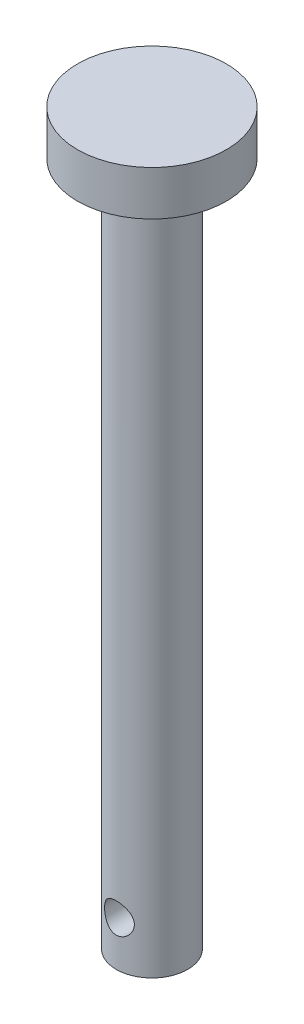
ISO-10303-21;
HEADER;
FILE_DESCRIPTION(('STEP AP214'),'2;1');
FILE_NAME('part.step','',(''),(''),'','','');
FILE_SCHEMA(('AUTOMOTIVE_DESIGN { 1 0 10303 214 1 1 1 1 }'));
ENDSEC;
DATA;
#1=APPLICATION_CONTEXT('core data for automotive mechanical design processes');
#2=APPLICATION_PROTOCOL_DEFINITION('international standard','automotive_design',2000,#1);
#3=PRODUCT_CONTEXT('',#1,'mechanical');
#4=PRODUCT('Part','Part','',(#3));
#5=PRODUCT_RELATED_PRODUCT_CATEGORY('part','',(#4));
#6=PRODUCT_DEFINITION_FORMATION('','',#4);
#7=PRODUCT_DEFINITION_CONTEXT('part definition',#1,'design');
#8=PRODUCT_DEFINITION('design','',#6,#7);
#9=PRODUCT_DEFINITION_SHAPE('','',#8);
#10=(LENGTH_UNIT() NAMED_UNIT(*) SI_UNIT(.MILLI.,.METRE.));
#11=(NAMED_UNIT(*) PLANE_ANGLE_UNIT() SI_UNIT($,.RADIAN.));
#12=(NAMED_UNIT(*) SI_UNIT($,.STERADIAN.) SOLID_ANGLE_UNIT());
#13=UNCERTAINTY_MEASURE_WITH_UNIT(LENGTH_MEASURE(1.E-05),#10,'distance_accuracy_value','');
#14=(GEOMETRIC_REPRESENTATION_CONTEXT(3) GLOBAL_UNCERTAINTY_ASSIGNED_CONTEXT((#13)) GLOBAL_UNIT_ASSIGNED_CONTEXT((#10,
#11,#12)) REPRESENTATION_CONTEXT('',''));
#15=CARTESIAN_POINT('',(0.,0.,0.));
#16=DIRECTION('',(0.,0.,1.));
#17=DIRECTION('',(1.,0.,0.));
#18=AXIS2_PLACEMENT_3D('',#15,#16,#17);
#19=CARTESIAN_POINT('',(0.,46.,0.));
#20=DIRECTION('',(0.,-1.,0.));
#21=DIRECTION('',(0.,0.,-1.));
#22=AXIS2_PLACEMENT_3D('',#19,#20,#21);
#23=CYLINDRICAL_SURFACE('',#22,2.4);
#24=CARTESIAN_POINT('',(0.,4.,-2.4));
#25=CARTESIAN_POINT('',(-0.0535664421090133,3.99999423592697,-2.39999566693818));
#26=CARTESIAN_POINT('',(-0.107217117651072,3.99567043317749,-2.39818586379768));
#27=CARTESIAN_POINT('',(-0.212997896925077,3.97852874806386,-2.39112122863641));
#28=CARTESIAN_POINT('',(-0.265123661138851,3.9656887004286,-2.38585740720822));
#29=CARTESIAN_POINT('',(-0.366150986922471,3.93207112657553,-2.37245031230502));
#30=CARTESIAN_POINT('',(-0.415062819541015,3.91132048842548,-2.36431679980003));
#31=CARTESIAN_POINT('',(-0.508663805343842,3.86258174141395,-2.34596229176531));
#32=CARTESIAN_POINT('',(-0.553354232012752,3.83459582482331,-2.33574192874279));
#33=CARTESIAN_POINT('',(-0.63955872284761,3.7706968139273,-2.31366262681495));
#34=CARTESIAN_POINT('',(-0.680833014014215,3.7344789529682,-2.30175002660874));
#35=CARTESIAN_POINT('',(-0.75692785687301,3.65578853217395,-2.27786171254811));
#36=CARTESIAN_POINT('',(-0.791745010522468,3.6133127000844,-2.26588596885447));
#37=CARTESIAN_POINT('',(-0.855629901576524,3.52077857794809,-2.24256817450396));
#38=CARTESIAN_POINT('',(-0.8843304652314,3.47045004125877,-2.23128629498708));
#39=CARTESIAN_POINT('',(-0.932751524710926,3.36514139366326,-2.21148457885604));
#40=CARTESIAN_POINT('',(-0.952476646690327,3.31016369641244,-2.20296332000659));
#41=CARTESIAN_POINT('',(-0.981396786497271,3.19987704658566,-2.19022844310164));
#42=CARTESIAN_POINT('',(-0.991053263020845,3.14471161328628,-2.1858271012143));
#43=CARTESIAN_POINT('',(-1.00100167974237,3.03338136585074,-2.18129060975603));
#44=CARTESIAN_POINT('',(-1.00129878443518,2.97721711997941,-2.18115310740208));
#45=CARTESIAN_POINT('',(-0.992867602909391,2.87007995165205,-2.18500095648682));
#46=CARTESIAN_POINT('',(-0.984829448898407,2.81903912274843,-2.18867106178898));
#47=CARTESIAN_POINT('',(-0.961113528126214,2.71911032719969,-2.19918786219037));
#48=CARTESIAN_POINT('',(-0.945434298297415,2.67022277480658,-2.20603516562851));
#49=CARTESIAN_POINT('',(-0.906575669820569,2.57475383760685,-2.22228947818205));
#50=CARTESIAN_POINT('',(-0.883243772313889,2.5282436632693,-2.23174785559309));
#51=CARTESIAN_POINT('',(-0.8298499406445,2.43961781289588,-2.25214664912869));
#52=CARTESIAN_POINT('',(-0.799785352415636,2.39750387950919,-2.26308764903824));
#53=CARTESIAN_POINT('',(-0.730796772435069,2.31512003301373,-2.28634381502383));
#54=CARTESIAN_POINT('',(-0.691338786566022,2.27530674609165,-2.29869697123578));
#55=CARTESIAN_POINT('',(-0.606183672841211,2.20270919763265,-2.32260538490023));
#56=CARTESIAN_POINT('',(-0.560485087558766,2.16992658264626,-2.33416045501608));
#57=CARTESIAN_POINT('',(-0.462758358954702,2.11165134110699,-2.35550626845178));
#58=CARTESIAN_POINT('',(-0.410608465958145,2.08634444387945,-2.36525013234667));
#59=CARTESIAN_POINT('',(-0.302281922021466,2.04502308831739,-2.38151585131843));
#60=CARTESIAN_POINT('',(-0.246107515836029,2.02900349444495,-2.3880394867664));
#61=CARTESIAN_POINT('',(-0.135142490676983,2.00766720629869,-2.39679712949108));
#62=CARTESIAN_POINT('',(-0.0804890282229121,2.001737714045,-2.399276328377));
#63=CARTESIAN_POINT('',(0.0290837243968705,1.99892302110872,-2.40044840294996));
#64=CARTESIAN_POINT('',(0.0840029337221078,2.0020352237984,-2.39914236569551));
#65=CARTESIAN_POINT('',(0.189678593873148,2.01677686784485,-2.39304974125552));
#66=CARTESIAN_POINT('',(0.240506373311509,2.02797596327776,-2.38843909827192));
#67=CARTESIAN_POINT('',(0.339506199176872,2.05797455563263,-2.37638885417931));
#68=CARTESIAN_POINT('',(0.387677909214688,2.07677501276024,-2.36894889567763));
#69=CARTESIAN_POINT('',(0.481687199895309,2.12205678056969,-2.35166616516132));
#70=CARTESIAN_POINT('',(0.527405789484259,2.14875854651683,-2.34175593175425));
#71=CARTESIAN_POINT('',(0.613876972985143,2.20884270223336,-2.32059043663272));
#72=CARTESIAN_POINT('',(0.654627482081553,2.24222788122342,-2.30933461414986));
#73=CARTESIAN_POINT('',(0.733066744219411,2.31752258661793,-2.2856967031635));
#74=CARTESIAN_POINT('',(0.770328558383868,2.35987080238901,-2.27329161272823));
#75=CARTESIAN_POINT('',(0.837335876884407,2.45041702074831,-2.24947469414404));
#76=CARTESIAN_POINT('',(0.867079674284939,2.49861634813739,-2.23806309194751));
#77=CARTESIAN_POINT('',(0.918527681669594,2.60049134024206,-2.2174510899519));
#78=CARTESIAN_POINT('',(0.940111345898631,2.65423522841186,-2.20828450044089));
#79=CARTESIAN_POINT('',(0.973739311612583,2.76509647504808,-2.19366684527166));
#80=CARTESIAN_POINT('',(0.985791478909501,2.82221100998668,-2.18821271644602));
#81=CARTESIAN_POINT('',(0.999232642791205,2.93345495935937,-2.18210531629811));
#82=CARTESIAN_POINT('',(1.00137104330503,2.98747572983409,-2.1811148077373));
#83=CARTESIAN_POINT('',(0.996924604191299,3.09507428891288,-2.18315082408819));
#84=CARTESIAN_POINT('',(0.990341103717773,3.14865214425095,-2.18617673232245));
#85=CARTESIAN_POINT('',(0.969267238243931,3.25127419797511,-2.19559641041814));
#86=CARTESIAN_POINT('',(0.95515922857173,3.30041333877071,-2.20182683877184));
#87=CARTESIAN_POINT('',(0.919810625617077,3.39563841708578,-2.21682544959351));
#88=CARTESIAN_POINT('',(0.898568028138016,3.44172349231903,-2.22559434505355));
#89=CARTESIAN_POINT('',(0.848082287483917,3.5325567167593,-2.2453356364801));
#90=CARTESIAN_POINT('',(0.818434887283867,3.57705786413463,-2.25640882170943));
#91=CARTESIAN_POINT('',(0.752547258104314,3.66068811148854,-2.27922951243071));
#92=CARTESIAN_POINT('',(0.716304743124496,3.69981534048046,-2.290977250767));
#93=CARTESIAN_POINT('',(0.635121636623058,3.7745189453478,-2.31485114280085));
#94=CARTESIAN_POINT('',(0.589739791959223,3.80962914627252,-2.32694254009433));
#95=CARTESIAN_POINT('',(0.493280063402561,3.8717595628349,-2.34928114897616));
#96=CARTESIAN_POINT('',(0.442199598356598,3.89877609191164,-2.35952751933392));
#97=CARTESIAN_POINT('',(0.336585645374361,3.94336787635191,-2.37687346689968));
#98=CARTESIAN_POINT('',(0.28212319278451,3.96109181329384,-2.38402226065571));
#99=CARTESIAN_POINT('',(0.170728337477248,3.98696506326227,-2.394568078149));
#100=CARTESIAN_POINT('',(0.113804253584767,3.99514435402391,-2.39797684649573));
#101=CARTESIAN_POINT('',(0.037788865535347,3.99946652886916,-2.39977830055147));
#102=CARTESIAN_POINT('',(0.0188996757405259,4.00000203371938,-2.40000152882029));
#103=CARTESIAN_POINT('',(0.,4.,-2.4));
#104=B_SPLINE_CURVE_WITH_KNOTS('',3,(#24,#25,#26,#27,#28,#29,#30,#31,#32,#33,#34,#35,#36,#37,
#38,#39,#40,#41,#42,#43,#44,#45,#46,#47,#48,#49,#50,#51,#52,#53,#54,#55,#56,#57,#58,#59,#60,#61,
#62,#63,#64,#65,#66,#67,#68,#69,#70,#71,#72,#73,#74,#75,#76,#77,#78,#79,#80,#81,#82,#83,#84,#85,
#86,#87,#88,#89,#90,#91,#92,#93,#94,#95,#96,#97,#98,#99,#100,#101,#102,#103),.UNSPECIFIED.,.T.,
.F.,(4,2,2,2,2,2,2,2,2,2,2,2,2,2,2,2,2,2,2,2,2,2,2,2,2,2,2,2,2,2,2,2,2,2,2,2,2,2,2,4),(0.,
0.160645535107151,0.321710832502957,0.482233481525041,0.64270754948238,0.810543490310456,
0.978467505051724,1.154653796313,1.3307491738447,1.49836218510046,1.66588270599237,
1.82056125762045,1.9752694378177,2.13326970446972,2.29133236573765,2.46275312902317,
2.6342139945167,2.80963244048651,2.98495379374638,3.14918754714601,3.31337413994538,
3.46941271788577,3.62547101281428,3.78637708217729,3.94735044375597,4.11982790423436,
4.29234448992273,4.46731830687619,4.64214757659665,4.80351902047715,4.96486569038029,
5.1187011997181,5.2725799596049,5.43571114717953,5.59889898740755,5.77397228003912,
5.94912519542866,6.12138284655508,6.29309800375457,6.34977805199279),.UNSPECIFIED.);
#105=CARTESIAN_POINT('',(0.,4.,-2.4));
#106=VERTEX_POINT('',#105);
#107=EDGE_CURVE('E35',#106,#106,#104,.T.);
#108=ORIENTED_EDGE('',*,*,#107,.T.);
#109=EDGE_LOOP('',(#108));
#110=FACE_BOUND('',#109,.T.);
#111=CARTESIAN_POINT('',(1.,3.,2.18174242292714));
#112=CARTESIAN_POINT('',(0.99999407253254,2.94666248728252,2.18174815650575));
#113=CARTESIAN_POINT('',(0.995705631052022,2.89323787453903,2.1837268762752));
#114=CARTESIAN_POINT('',(0.978717431582277,2.78793044635429,2.19139066920707));
#115=CARTESIAN_POINT('',(0.965994832026212,2.73605221865981,2.19708580659413));
#116=CARTESIAN_POINT('',(0.932719907355606,2.63555109624714,2.21141534059814));
#117=CARTESIAN_POINT('',(0.912199499451424,2.58691586902799,2.22003774050092));
#118=CARTESIAN_POINT('',(0.864005102035701,2.49379244033756,2.23923318852634));
#119=CARTESIAN_POINT('',(0.83633280473225,2.4493032612535,2.24980577504627));
#120=CARTESIAN_POINT('',(0.772779106140933,2.36293942002122,2.27244610095885));
#121=CARTESIAN_POINT('',(0.736522590547527,2.32135395300473,2.28456454463317));
#122=CARTESIAN_POINT('',(0.65761734059644,2.24463982200195,2.30851436297781));
#123=CARTESIAN_POINT('',(0.614966153099204,2.20951364750959,2.32034562544631));
#124=CARTESIAN_POINT('',(0.522210715037879,2.14524037529658,2.34300430344491));
#125=CARTESIAN_POINT('',(0.471863434946927,2.11641869757412,2.35376591980233));
#126=CARTESIAN_POINT('',(0.366505617889882,2.06777918359552,2.37245215994741));
#127=CARTESIAN_POINT('',(0.311497163897699,2.04795735042863,2.38037804277725));
#128=CARTESIAN_POINT('',(0.201414798420132,2.01892843299461,2.39214016833893));
#129=CARTESIAN_POINT('',(0.146493260956864,2.00922264407836,2.39616776901973));
#130=CARTESIAN_POINT('',(0.0356633442920048,1.99908988707211,2.40037462888963));
#131=CARTESIAN_POINT('',(-0.0202446254116131,1.99865915529363,2.40055544904812));
#132=CARTESIAN_POINT('',(-0.127834224090054,2.00682742474666,2.39716103306445));
#133=CARTESIAN_POINT('',(-0.179565990885851,2.01487848042058,2.39381371718931));
#134=CARTESIAN_POINT('',(-0.280866315145165,2.03884248211053,2.38405213400247));
#135=CARTESIAN_POINT('',(-0.330434712843933,2.05475600770413,2.37763764059661));
#136=CARTESIAN_POINT('',(-0.42691049446202,2.09418243271571,2.36223881931223));
#137=CARTESIAN_POINT('',(-0.473765741659925,2.11780757029666,2.35321677700868));
#138=CARTESIAN_POINT('',(-0.562969413825571,2.17187660536027,2.33348571191844));
#139=CARTESIAN_POINT('',(-0.605316238205579,2.20232291267599,2.32277609333004));
#140=CARTESIAN_POINT('',(-0.687472729366339,2.27166593632369,2.29985359021649));
#141=CARTESIAN_POINT('',(-0.726893149852992,2.3110070330232,2.28758795484808));
#142=CARTESIAN_POINT('',(-0.798745131942134,2.39576915256526,2.26350288545176));
#143=CARTESIAN_POINT('',(-0.831173996659451,2.44119251063367,2.25168362505096));
#144=CARTESIAN_POINT('',(-0.889121514000508,2.53871602932953,2.22945289884271));
#145=CARTESIAN_POINT('',(-0.914378026844322,2.59098656459462,2.21910046845371));
#146=CARTESIAN_POINT('',(-0.955571456467133,2.6995848359796,2.20167875376809));
#147=CARTESIAN_POINT('',(-0.971515037018505,2.75590963861564,2.19460712267675));
#148=CARTESIAN_POINT('',(-0.99264020134497,2.8671174471312,2.18512970015779));
#149=CARTESIAN_POINT('',(-0.998452917062928,2.92185689780724,2.18245095357693));
#150=CARTESIAN_POINT('',(-1.00100504415199,3.0315827859292,2.18128229448514));
#151=CARTESIAN_POINT('',(-0.997747594545193,3.08656913135337,2.18279093279455));
#152=CARTESIAN_POINT('',(-0.98282782052445,3.19151870834436,2.18954505076599));
#153=CARTESIAN_POINT('',(-0.971716950544387,3.24157814942944,2.19454510413294));
#154=CARTESIAN_POINT('',(-0.942136468513803,3.3390810371983,2.20740504237957));
#155=CARTESIAN_POINT('',(-0.923665136424999,3.38652386946457,2.21526559568129));
#156=CARTESIAN_POINT('',(-0.879020166441493,3.47969224828518,2.233366382856));
#157=CARTESIAN_POINT('',(-0.852553466449583,3.52525997968826,2.24369329761826));
#158=CARTESIAN_POINT('',(-0.792960627508777,3.61152644199922,2.26544002992635));
#159=CARTESIAN_POINT('',(-0.75983160630079,3.65222305336149,2.27686031936467));
#160=CARTESIAN_POINT('',(-0.684675564572404,3.7310401079072,2.30062895827626));
#161=CARTESIAN_POINT('',(-0.642143729183791,3.76868111996053,2.31297717367073));
#162=CARTESIAN_POINT('',(-0.551081210042832,3.83637783358346,2.33634688947138));
#163=CARTESIAN_POINT('',(-0.502550087042926,3.86643297925096,2.34736829261611));
#164=CARTESIAN_POINT('',(-0.400523744642708,3.91807190035486,2.3669140126852));
#165=CARTESIAN_POINT('',(-0.347016135710806,3.93963379303158,2.37543186511061));
#166=CARTESIAN_POINT('',(-0.236687068123534,3.97329343386754,2.38894538482693));
#167=CARTESIAN_POINT('',(-0.179867603380157,3.98539681458085,2.39394314815936));
#168=CARTESIAN_POINT('',(-0.0688132268051296,3.99908650041625,2.39961227838008));
#169=CARTESIAN_POINT('',(-0.0146752678351191,4.00134879975757,2.4005616362738));
#170=CARTESIAN_POINT('',(0.0931894493714275,3.99710948696485,2.39879618784762));
#171=CARTESIAN_POINT('',(0.146916278032924,3.99060941118971,2.3960820238745));
#172=CARTESIAN_POINT('',(0.250469185959347,3.96951514227307,2.38744052785388));
#173=CARTESIAN_POINT('',(0.300366030274855,3.95521625562436,2.38163059367387));
#174=CARTESIAN_POINT('',(0.397033784401065,3.9192526022327,2.36743599877646));
#175=CARTESIAN_POINT('',(0.443804098388661,3.89758643626808,2.35905084899365));
#176=CARTESIAN_POINT('',(0.535219652383025,3.84640837662843,2.3400466031893));
#177=CARTESIAN_POINT('',(0.579673326381346,3.81658615886081,2.32934367351013));
#178=CARTESIAN_POINT('',(0.663134940511025,3.75039425370249,2.30697249499385));
#179=CARTESIAN_POINT('',(0.702140849428834,3.7140221356746,2.29530388867038));
#180=CARTESIAN_POINT('',(0.776359829785264,3.63284413931648,2.27131876207312));
#181=CARTESIAN_POINT('',(0.811134202918775,3.5876327883031,2.25901218286317));
#182=CARTESIAN_POINT('',(0.872666658453395,3.49163300745585,2.23596442152149));
#183=CARTESIAN_POINT('',(0.899420259654039,3.44084148155349,2.22522411618047));
#184=CARTESIAN_POINT('',(0.943862128348617,3.3352449319818,2.20674046186114));
#185=CARTESIAN_POINT('',(0.961598589062829,3.28046307296543,2.19898123575892));
#186=CARTESIAN_POINT('',(0.987388451630409,3.16836834091947,2.18752642453334));
#187=CARTESIAN_POINT('',(0.99547433216968,3.11106463418056,2.18381721283984));
#188=CARTESIAN_POINT('',(0.999523719389198,3.03571318059049,2.1819598378615));
#189=CARTESIAN_POINT('',(1.00000198496895,3.01786147408957,2.18174050288699));
#190=CARTESIAN_POINT('',(1.,3.,2.18174242292714));
#191=B_SPLINE_CURVE_WITH_KNOTS('',3,(#111,#112,#113,#114,#115,#116,#117,#118,#119,#120,#121,
#122,#123,#124,#125,#126,#127,#128,#129,#130,#131,#132,#133,#134,#135,#136,#137,#138,#139,#140,
#141,#142,#143,#144,#145,#146,#147,#148,#149,#150,#151,#152,#153,#154,#155,#156,#157,#158,#159,
#160,#161,#162,#163,#164,#165,#166,#167,#168,#169,#170,#171,#172,#173,#174,#175,#176,#177,#178,
#179,#180,#181,#182,#183,#184,#185,#186,#187,#188,#189,#190),.UNSPECIFIED.,.T.,.F.,(4,2,2,2,2,2,
2,2,2,2,2,2,2,2,2,2,2,2,2,2,2,2,2,2,2,2,2,2,2,2,2,2,2,2,2,2,2,2,2,4),(0.,0.159961369588412,
0.32035772947374,0.48010452172169,0.639813550840081,0.808534731445231,0.977320803679285,
1.15342781262339,1.32945653419913,1.49632484782362,1.66312544734344,1.81977472196074,
1.97643554561507,2.13548651712052,2.29459376817987,2.46491625475588,2.63530432353093,
2.81129236533378,2.98715432596455,3.15160622645046,3.31600122014759,3.46987120852954,
3.62377717530824,3.78420101454535,3.94469440636373,4.11825330188411,4.29182491233493,
4.46584084764476,4.63975307714406,4.80150908075243,4.96323672641532,5.1192273202919,
5.27524755705738,5.4383189026323,5.60145088839124,5.77568341526462,5.95001310511351,
6.12340100637492,6.2962037163693,6.34977100349365),.UNSPECIFIED.);
#192=CARTESIAN_POINT('',(1.,3.,2.18174242292714));
#193=VERTEX_POINT('',#192);
#194=EDGE_CURVE('E52',#193,#193,#191,.T.);
#195=ORIENTED_EDGE('',*,*,#194,.T.);
#196=EDGE_LOOP('',(#195));
#197=FACE_BOUND('',#196,.T.);
#198=CARTESIAN_POINT('',(0.,46.,0.));
#199=DIRECTION('',(0.,1.,0.));
#200=DIRECTION('',(0.,0.,1.));
#201=AXIS2_PLACEMENT_3D('',#198,#199,#200);
#202=CIRCLE('',#201,2.4);
#203=CARTESIAN_POINT('',(0.,46.,2.4));
#204=VERTEX_POINT('',#203);
#205=EDGE_CURVE('E10',#204,#204,#202,.T.);
#206=ORIENTED_EDGE('',*,*,#205,.F.);
#207=EDGE_LOOP('',(#206));
#208=FACE_BOUND('',#207,.T.);
#209=CARTESIAN_POINT('',(0.,0.,0.));
#210=DIRECTION('',(0.,1.,0.));
#211=DIRECTION('',(0.,0.,1.));
#212=AXIS2_PLACEMENT_3D('',#209,#210,#211);
#213=CIRCLE('',#212,2.4);
#214=CARTESIAN_POINT('',(0.,0.,2.4));
#215=VERTEX_POINT('',#214);
#216=EDGE_CURVE('E42',#215,#215,#213,.T.);
#217=ORIENTED_EDGE('',*,*,#216,.T.);
#218=EDGE_LOOP('',(#217));
#219=FACE_BOUND('',#218,.T.);
#220=ADVANCED_FACE('F31',(#110,#197,#208,#219),#23,.T.);
#221=CARTESIAN_POINT('',(0.,0.,0.));
#222=DIRECTION('',(0.,1.,0.));
#223=DIRECTION('',(0.,0.,1.));
#224=AXIS2_PLACEMENT_3D('',#221,#222,#223);
#225=PLANE('',#224);
#226=ORIENTED_EDGE('',*,*,#216,.F.);
#227=EDGE_LOOP('',(#226));
#228=FACE_BOUND('',#227,.T.);
#229=ADVANCED_FACE('F71',(#228),#225,.F.);
#230=CARTESIAN_POINT('',(0.,49.,0.));
#231=DIRECTION('',(0.,-1.,0.));
#232=DIRECTION('',(0.,0.,-1.));
#233=AXIS2_PLACEMENT_3D('',#230,#231,#232);
#234=CYLINDRICAL_SURFACE('',#233,5.);
#235=CARTESIAN_POINT('',(0.,49.,0.));
#236=DIRECTION('',(0.,1.,0.));
#237=DIRECTION('',(0.,0.,1.));
#238=AXIS2_PLACEMENT_3D('',#235,#236,#237);
#239=CIRCLE('',#238,5.);
#240=CARTESIAN_POINT('',(0.,49.,5.));
#241=VERTEX_POINT('',#240);
#242=EDGE_CURVE('E47',#241,#241,#239,.T.);
#243=ORIENTED_EDGE('',*,*,#242,.F.);
#244=EDGE_LOOP('',(#243));
#245=FACE_BOUND('',#244,.T.);
#246=CARTESIAN_POINT('',(0.,46.,0.));
#247=DIRECTION('',(0.,1.,0.));
#248=DIRECTION('',(0.,0.,1.));
#249=AXIS2_PLACEMENT_3D('',#246,#247,#248);
#250=CIRCLE('',#249,5.);
#251=CARTESIAN_POINT('',(0.,46.,5.));
#252=VERTEX_POINT('',#251);
#253=EDGE_CURVE('E50',#252,#252,#250,.T.);
#254=ORIENTED_EDGE('',*,*,#253,.T.);
#255=EDGE_LOOP('',(#254));
#256=FACE_BOUND('',#255,.T.);
#257=ADVANCED_FACE('F66',(#245,#256),#234,.T.);
#258=CARTESIAN_POINT('',(0.,49.,0.));
#259=DIRECTION('',(0.,1.,0.));
#260=DIRECTION('',(0.,0.,1.));
#261=AXIS2_PLACEMENT_3D('',#258,#259,#260);
#262=PLANE('',#261);
#263=ORIENTED_EDGE('',*,*,#242,.T.);
#264=EDGE_LOOP('',(#263));
#265=FACE_BOUND('',#264,.T.);
#266=ADVANCED_FACE('F62',(#265),#262,.T.);
#267=CARTESIAN_POINT('',(0.,46.,0.));
#268=DIRECTION('',(0.,1.,0.));
#269=DIRECTION('',(0.,0.,1.));
#270=AXIS2_PLACEMENT_3D('',#267,#268,#269);
#271=PLANE('',#270);
#272=ORIENTED_EDGE('',*,*,#205,.T.);
#273=EDGE_LOOP('',(#272));
#274=FACE_BOUND('',#273,.T.);
#275=ORIENTED_EDGE('',*,*,#253,.F.);
#276=EDGE_LOOP('',(#275));
#277=FACE_BOUND('',#276,.T.);
#278=ADVANCED_FACE('F60',(#274,#277),#271,.F.);
#279=CARTESIAN_POINT('',(0.,3.,-5.));
#280=DIRECTION('',(0.,0.,1.));
#281=DIRECTION('',(1.,0.,0.));
#282=AXIS2_PLACEMENT_3D('',#279,#280,#281);
#283=CYLINDRICAL_SURFACE('',#282,1.);
#284=ORIENTED_EDGE('',*,*,#194,.F.);
#285=EDGE_LOOP('',(#284));
#286=FACE_BOUND('',#285,.T.);
#287=ORIENTED_EDGE('',*,*,#107,.F.);
#288=EDGE_LOOP('',(#287));
#289=FACE_BOUND('',#288,.T.);
#290=ADVANCED_FACE('F56',(#286,#289),#283,.F.);
#291=CLOSED_SHELL('',(#220,#229,#257,#266,#278,#290));
#292=MANIFOLD_SOLID_BREP('B2',#291);
#293=ADVANCED_BREP_SHAPE_REPRESENTATION('',(#18,#292),#14);
#294=SHAPE_DEFINITION_REPRESENTATION(#9,#293);
ENDSEC;
END-ISO-10303-21;
